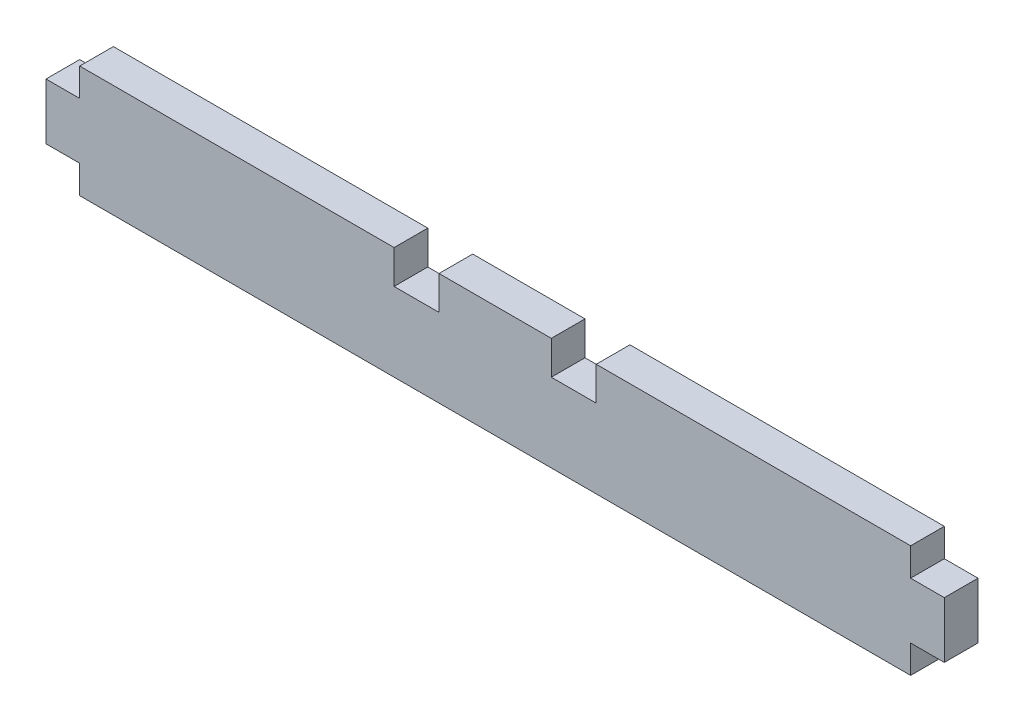
ISO-10303-21;
HEADER;
FILE_DESCRIPTION(('STEP AP214'),'2;1');
FILE_NAME('part.step','',(''),(''),'','','');
FILE_SCHEMA(('AUTOMOTIVE_DESIGN { 1 0 10303 214 1 1 1 1 }'));
ENDSEC;
DATA;
#1=APPLICATION_CONTEXT('core data for automotive mechanical design processes');
#2=APPLICATION_PROTOCOL_DEFINITION('international standard','automotive_design',2000,#1);
#3=PRODUCT_CONTEXT('',#1,'mechanical');
#4=PRODUCT('Part','Part','',(#3));
#5=PRODUCT_RELATED_PRODUCT_CATEGORY('part','',(#4));
#6=PRODUCT_DEFINITION_FORMATION('','',#4);
#7=PRODUCT_DEFINITION_CONTEXT('part definition',#1,'design');
#8=PRODUCT_DEFINITION('design','',#6,#7);
#9=PRODUCT_DEFINITION_SHAPE('','',#8);
#10=(LENGTH_UNIT() NAMED_UNIT(*) SI_UNIT(.MILLI.,.METRE.));
#11=(NAMED_UNIT(*) PLANE_ANGLE_UNIT() SI_UNIT($,.RADIAN.));
#12=(NAMED_UNIT(*) SI_UNIT($,.STERADIAN.) SOLID_ANGLE_UNIT());
#13=UNCERTAINTY_MEASURE_WITH_UNIT(LENGTH_MEASURE(1.E-05),#10,'distance_accuracy_value','');
#14=(GEOMETRIC_REPRESENTATION_CONTEXT(3) GLOBAL_UNCERTAINTY_ASSIGNED_CONTEXT((#13)) GLOBAL_UNIT_ASSIGNED_CONTEXT((#10,
#11,#12)) REPRESENTATION_CONTEXT('',''));
#15=CARTESIAN_POINT('',(0.,0.,0.));
#16=DIRECTION('',(0.,0.,1.));
#17=DIRECTION('',(1.,0.,0.));
#18=AXIS2_PLACEMENT_3D('',#15,#16,#17);
#19=CARTESIAN_POINT('',(-9.,0.,3.));
#20=DIRECTION('',(-1.,0.,0.));
#21=DIRECTION('',(0.,0.,1.));
#22=AXIS2_PLACEMENT_3D('',#19,#20,#21);
#23=PLANE('',#22);
#24=DIRECTION('',(0.,1.,0.));
#25=VECTOR('',#24,1.);
#26=CARTESIAN_POINT('',(-9.,0.,0.));
#27=LINE('',#26,#25);
#28=CARTESIAN_POINT('',(-9.,3.5,0.));
#29=VERTEX_POINT('',#28);
#30=CARTESIAN_POINT('',(-9.,6.5,0.));
#31=VERTEX_POINT('',#30);
#32=EDGE_CURVE('E238',#29,#31,#27,.T.);
#33=ORIENTED_EDGE('',*,*,#32,.T.);
#34=DIRECTION('',(0.,0.,-1.));
#35=VECTOR('',#34,1.);
#36=CARTESIAN_POINT('',(-9.,6.5,3.));
#37=LINE('',#36,#35);
#38=CARTESIAN_POINT('',(-9.,6.5,3.));
#39=VERTEX_POINT('',#38);
#40=EDGE_CURVE('E227',#39,#31,#37,.T.);
#41=ORIENTED_EDGE('',*,*,#40,.F.);
#42=DIRECTION('',(0.,1.,0.));
#43=VECTOR('',#42,1.);
#44=CARTESIAN_POINT('',(-9.,0.,3.));
#45=LINE('',#44,#43);
#46=CARTESIAN_POINT('',(-9.,3.5,3.));
#47=VERTEX_POINT('',#46);
#48=EDGE_CURVE('E270',#47,#39,#45,.T.);
#49=ORIENTED_EDGE('',*,*,#48,.F.);
#50=DIRECTION('',(0.,0.,-1.));
#51=VECTOR('',#50,1.);
#52=CARTESIAN_POINT('',(-9.,3.5,3.));
#53=LINE('',#52,#51);
#54=EDGE_CURVE('E224',#47,#29,#53,.T.);
#55=ORIENTED_EDGE('',*,*,#54,.T.);
#56=EDGE_LOOP('',(#33,#41,#49,#55));
#57=FACE_BOUND('',#56,.T.);
#58=ADVANCED_FACE('F83',(#57),#23,.F.);
#59=CARTESIAN_POINT('',(0.,3.5,3.));
#60=DIRECTION('',(0.,1.,0.));
#61=DIRECTION('',(0.,0.,1.));
#62=AXIS2_PLACEMENT_3D('',#59,#60,#61);
#63=PLANE('',#62);
#64=DIRECTION('',(1.,0.,0.));
#65=VECTOR('',#64,1.);
#66=CARTESIAN_POINT('',(0.,3.5,0.));
#67=LINE('',#66,#65);
#68=CARTESIAN_POINT('',(-5.,3.5,0.));
#69=VERTEX_POINT('',#68);
#70=EDGE_CURVE('E241',#29,#69,#67,.T.);
#71=ORIENTED_EDGE('',*,*,#70,.F.);
#72=ORIENTED_EDGE('',*,*,#54,.F.);
#73=DIRECTION('',(1.,0.,0.));
#74=VECTOR('',#73,1.);
#75=CARTESIAN_POINT('',(0.,3.5,3.));
#76=LINE('',#75,#74);
#77=CARTESIAN_POINT('',(-5.,3.5,3.));
#78=VERTEX_POINT('',#77);
#79=EDGE_CURVE('E273',#47,#78,#76,.T.);
#80=ORIENTED_EDGE('',*,*,#79,.T.);
#81=DIRECTION('',(0.,0.,-1.));
#82=VECTOR('',#81,1.);
#83=CARTESIAN_POINT('',(-5.,3.5,3.));
#84=LINE('',#83,#82);
#85=EDGE_CURVE('E221',#78,#69,#84,.T.);
#86=ORIENTED_EDGE('',*,*,#85,.T.);
#87=EDGE_LOOP('',(#71,#72,#80,#86));
#88=FACE_BOUND('',#87,.T.);
#89=ADVANCED_FACE('F384',(#88),#63,.T.);
#90=CARTESIAN_POINT('',(-5.,0.,3.));
#91=DIRECTION('',(-1.,0.,0.));
#92=DIRECTION('',(0.,0.,1.));
#93=AXIS2_PLACEMENT_3D('',#90,#91,#92);
#94=PLANE('',#93);
#95=DIRECTION('',(0.,1.,0.));
#96=VECTOR('',#95,1.);
#97=CARTESIAN_POINT('',(-5.,0.,0.));
#98=LINE('',#97,#96);
#99=CARTESIAN_POINT('',(-5.,6.5,0.));
#100=VERTEX_POINT('',#99);
#101=EDGE_CURVE('E242',#69,#100,#98,.T.);
#102=ORIENTED_EDGE('',*,*,#101,.F.);
#103=ORIENTED_EDGE('',*,*,#85,.F.);
#104=DIRECTION('',(0.,1.,0.));
#105=VECTOR('',#104,1.);
#106=CARTESIAN_POINT('',(-5.,0.,3.));
#107=LINE('',#106,#105);
#108=CARTESIAN_POINT('',(-5.,6.5,3.));
#109=VERTEX_POINT('',#108);
#110=EDGE_CURVE('E274',#78,#109,#107,.T.);
#111=ORIENTED_EDGE('',*,*,#110,.T.);
#112=DIRECTION('',(0.,0.,-1.));
#113=VECTOR('',#112,1.);
#114=CARTESIAN_POINT('',(-5.,6.5,3.));
#115=LINE('',#114,#113);
#116=EDGE_CURVE('E218',#109,#100,#115,.T.);
#117=ORIENTED_EDGE('',*,*,#116,.T.);
#118=EDGE_LOOP('',(#102,#103,#111,#117));
#119=FACE_BOUND('',#118,.T.);
#120=ADVANCED_FACE('F389',(#119),#94,.T.);
#121=CARTESIAN_POINT('',(0.,6.5,3.));
#122=DIRECTION('',(0.,1.,0.));
#123=DIRECTION('',(0.,0.,1.));
#124=AXIS2_PLACEMENT_3D('',#121,#122,#123);
#125=PLANE('',#124);
#126=DIRECTION('',(1.,0.,0.));
#127=VECTOR('',#126,1.);
#128=CARTESIAN_POINT('',(0.,6.5,0.));
#129=LINE('',#128,#127);
#130=CARTESIAN_POINT('',(5.,6.5,0.));
#131=VERTEX_POINT('',#130);
#132=EDGE_CURVE('E245',#100,#131,#129,.T.);
#133=ORIENTED_EDGE('',*,*,#132,.F.);
#134=ORIENTED_EDGE('',*,*,#116,.F.);
#135=DIRECTION('',(1.,0.,0.));
#136=VECTOR('',#135,1.);
#137=CARTESIAN_POINT('',(0.,6.5,3.));
#138=LINE('',#137,#136);
#139=CARTESIAN_POINT('',(5.,6.5,3.));
#140=VERTEX_POINT('',#139);
#141=EDGE_CURVE('E277',#109,#140,#138,.T.);
#142=ORIENTED_EDGE('',*,*,#141,.T.);
#143=DIRECTION('',(0.,0.,-1.));
#144=VECTOR('',#143,1.);
#145=CARTESIAN_POINT('',(5.,6.5,3.));
#146=LINE('',#145,#144);
#147=EDGE_CURVE('E215',#140,#131,#146,.T.);
#148=ORIENTED_EDGE('',*,*,#147,.T.);
#149=EDGE_LOOP('',(#133,#134,#142,#148));
#150=FACE_BOUND('',#149,.T.);
#151=ADVANCED_FACE('F395',(#150),#125,.T.);
#152=CARTESIAN_POINT('',(5.,0.,3.));
#153=DIRECTION('',(-1.,0.,0.));
#154=DIRECTION('',(0.,0.,1.));
#155=AXIS2_PLACEMENT_3D('',#152,#153,#154);
#156=PLANE('',#155);
#157=DIRECTION('',(0.,1.,0.));
#158=VECTOR('',#157,1.);
#159=CARTESIAN_POINT('',(5.,0.,0.));
#160=LINE('',#159,#158);
#161=CARTESIAN_POINT('',(5.,3.5,0.));
#162=VERTEX_POINT('',#161);
#163=EDGE_CURVE('E248',#162,#131,#160,.T.);
#164=ORIENTED_EDGE('',*,*,#163,.T.);
#165=ORIENTED_EDGE('',*,*,#147,.F.);
#166=DIRECTION('',(0.,1.,0.));
#167=VECTOR('',#166,1.);
#168=CARTESIAN_POINT('',(5.,0.,3.));
#169=LINE('',#168,#167);
#170=CARTESIAN_POINT('',(5.,3.5,3.));
#171=VERTEX_POINT('',#170);
#172=EDGE_CURVE('E280',#171,#140,#169,.T.);
#173=ORIENTED_EDGE('',*,*,#172,.F.);
#174=DIRECTION('',(0.,0.,-1.));
#175=VECTOR('',#174,1.);
#176=CARTESIAN_POINT('',(5.,3.5,3.));
#177=LINE('',#176,#175);
#178=EDGE_CURVE('E212',#171,#162,#177,.T.);
#179=ORIENTED_EDGE('',*,*,#178,.T.);
#180=EDGE_LOOP('',(#164,#165,#173,#179));
#181=FACE_BOUND('',#180,.T.);
#182=ADVANCED_FACE('F402',(#181),#156,.F.);
#183=CARTESIAN_POINT('',(9.,3.5,0.));
#184=VERTEX_POINT('',#183);
#185=EDGE_CURVE('E251',#162,#184,#67,.T.);
#186=ORIENTED_EDGE('',*,*,#185,.F.);
#187=ORIENTED_EDGE('',*,*,#178,.F.);
#188=CARTESIAN_POINT('',(9.,3.5,3.));
#189=VERTEX_POINT('',#188);
#190=EDGE_CURVE('E283',#171,#189,#76,.T.);
#191=ORIENTED_EDGE('',*,*,#190,.T.);
#192=DIRECTION('',(0.,0.,-1.));
#193=VECTOR('',#192,1.);
#194=CARTESIAN_POINT('',(9.,3.5,3.));
#195=LINE('',#194,#193);
#196=EDGE_CURVE('E209',#189,#184,#195,.T.);
#197=ORIENTED_EDGE('',*,*,#196,.T.);
#198=EDGE_LOOP('',(#186,#187,#191,#197));
#199=FACE_BOUND('',#198,.T.);
#200=ADVANCED_FACE('F407',(#199),#63,.T.);
#201=CARTESIAN_POINT('',(9.,0.,3.));
#202=DIRECTION('',(-1.,0.,0.));
#203=DIRECTION('',(0.,0.,1.));
#204=AXIS2_PLACEMENT_3D('',#201,#202,#203);
#205=PLANE('',#204);
#206=DIRECTION('',(0.,1.,0.));
#207=VECTOR('',#206,1.);
#208=CARTESIAN_POINT('',(9.,0.,0.));
#209=LINE('',#208,#207);
#210=CARTESIAN_POINT('',(9.,6.5,0.));
#211=VERTEX_POINT('',#210);
#212=EDGE_CURVE('E254',#184,#211,#209,.T.);
#213=ORIENTED_EDGE('',*,*,#212,.F.);
#214=ORIENTED_EDGE('',*,*,#196,.F.);
#215=DIRECTION('',(0.,1.,0.));
#216=VECTOR('',#215,1.);
#217=CARTESIAN_POINT('',(9.,0.,3.));
#218=LINE('',#217,#216);
#219=CARTESIAN_POINT('',(9.,6.5,3.));
#220=VERTEX_POINT('',#219);
#221=EDGE_CURVE('E286',#189,#220,#218,.T.);
#222=ORIENTED_EDGE('',*,*,#221,.T.);
#223=DIRECTION('',(0.,0.,-1.));
#224=VECTOR('',#223,1.);
#225=CARTESIAN_POINT('',(9.,6.5,3.));
#226=LINE('',#225,#224);
#227=EDGE_CURVE('E206',#220,#211,#226,.T.);
#228=ORIENTED_EDGE('',*,*,#227,.T.);
#229=EDGE_LOOP('',(#213,#214,#222,#228));
#230=FACE_BOUND('',#229,.T.);
#231=ADVANCED_FACE('F452',(#230),#205,.T.);
#232=CARTESIAN_POINT('',(0.,6.5,3.));
#233=DIRECTION('',(0.,1.,0.));
#234=DIRECTION('',(0.,0.,1.));
#235=AXIS2_PLACEMENT_3D('',#232,#233,#234);
#236=PLANE('',#235);
#237=DIRECTION('',(1.,0.,0.));
#238=VECTOR('',#237,1.);
#239=CARTESIAN_POINT('',(0.,6.5,0.));
#240=LINE('',#239,#238);
#241=CARTESIAN_POINT('',(-37.,6.5,0.));
#242=VERTEX_POINT('',#241);
#243=EDGE_CURVE('E234',#242,#31,#240,.T.);
#244=ORIENTED_EDGE('',*,*,#243,.F.);
#245=DIRECTION('',(0.,0.,-1.));
#246=VECTOR('',#245,1.);
#247=CARTESIAN_POINT('',(-37.,6.5,3.));
#248=LINE('',#247,#246);
#249=CARTESIAN_POINT('',(-37.,6.5,3.));
#250=VERTEX_POINT('',#249);
#251=EDGE_CURVE('E230',#250,#242,#248,.T.);
#252=ORIENTED_EDGE('',*,*,#251,.F.);
#253=DIRECTION('',(1.,0.,0.));
#254=VECTOR('',#253,1.);
#255=CARTESIAN_POINT('',(0.,6.5,3.));
#256=LINE('',#255,#254);
#257=EDGE_CURVE('E233',#250,#39,#256,.T.);
#258=ORIENTED_EDGE('',*,*,#257,.T.);
#259=ORIENTED_EDGE('',*,*,#40,.T.);
#260=EDGE_LOOP('',(#244,#252,#258,#259));
#261=FACE_BOUND('',#260,.T.);
#262=ADVANCED_FACE('F315',(#261),#236,.T.);
#263=CARTESIAN_POINT('',(0.,-3.5,3.));
#264=DIRECTION('',(0.,1.,0.));
#265=DIRECTION('',(0.,0.,1.));
#266=AXIS2_PLACEMENT_3D('',#263,#264,#265);
#267=PLANE('',#266);
#268=DIRECTION('',(1.,0.,0.));
#269=VECTOR('',#268,1.);
#270=CARTESIAN_POINT('',(0.,-3.5,0.));
#271=LINE('',#270,#269);
#272=CARTESIAN_POINT('',(-37.,-3.5,0.));
#273=VERTEX_POINT('',#272);
#274=CARTESIAN_POINT('',(37.,-3.5,0.));
#275=VERTEX_POINT('',#274);
#276=EDGE_CURVE('E263',#273,#275,#271,.T.);
#277=ORIENTED_EDGE('',*,*,#276,.T.);
#278=DIRECTION('',(0.,0.,-1.));
#279=VECTOR('',#278,1.);
#280=CARTESIAN_POINT('',(37.,-3.5,3.));
#281=LINE('',#280,#279);
#282=CARTESIAN_POINT('',(37.,-3.5,3.));
#283=VERTEX_POINT('',#282);
#284=EDGE_CURVE('E200',#283,#275,#281,.T.);
#285=ORIENTED_EDGE('',*,*,#284,.F.);
#286=DIRECTION('',(1.,0.,0.));
#287=VECTOR('',#286,1.);
#288=CARTESIAN_POINT('',(0.,-3.5,3.));
#289=LINE('',#288,#287);
#290=CARTESIAN_POINT('',(-37.,-3.5,3.));
#291=VERTEX_POINT('',#290);
#292=EDGE_CURVE('E296',#291,#283,#289,.T.);
#293=ORIENTED_EDGE('',*,*,#292,.F.);
#294=DIRECTION('',(0.,0.,-1.));
#295=VECTOR('',#294,1.);
#296=CARTESIAN_POINT('',(-37.,-3.5,3.));
#297=LINE('',#296,#295);
#298=EDGE_CURVE('E197',#291,#273,#297,.T.);
#299=ORIENTED_EDGE('',*,*,#298,.T.);
#300=EDGE_LOOP('',(#277,#285,#293,#299));
#301=FACE_BOUND('',#300,.T.);
#302=ADVANCED_FACE('F365',(#301),#267,.F.);
#303=CARTESIAN_POINT('',(0.,6.49999999999999,3.));
#304=DIRECTION('',(0.,-1.,0.));
#305=DIRECTION('',(1.,0.,0.));
#306=AXIS2_PLACEMENT_3D('',#303,#304,#305);
#307=PLANE('',#306);
#308=DIRECTION('',(-1.,0.,0.));
#309=VECTOR('',#308,1.);
#310=CARTESIAN_POINT('',(0.,6.49999999999999,0.));
#311=LINE('',#310,#309);
#312=CARTESIAN_POINT('',(37.,6.5,0.));
#313=VERTEX_POINT('',#312);
#314=EDGE_CURVE('E257',#313,#211,#311,.T.);
#315=ORIENTED_EDGE('',*,*,#314,.T.);
#316=ORIENTED_EDGE('',*,*,#227,.F.);
#317=DIRECTION('',(-1.,0.,0.));
#318=VECTOR('',#317,1.);
#319=CARTESIAN_POINT('',(0.,6.49999999999999,3.));
#320=LINE('',#319,#318);
#321=CARTESIAN_POINT('',(37.,6.5,3.));
#322=VERTEX_POINT('',#321);
#323=EDGE_CURVE('E289',#322,#220,#320,.T.);
#324=ORIENTED_EDGE('',*,*,#323,.F.);
#325=DIRECTION('',(0.,0.,-1.));
#326=VECTOR('',#325,1.);
#327=CARTESIAN_POINT('',(37.,6.5,3.));
#328=LINE('',#327,#326);
#329=EDGE_CURVE('E203',#322,#313,#328,.T.);
#330=ORIENTED_EDGE('',*,*,#329,.T.);
#331=EDGE_LOOP('',(#315,#316,#324,#330));
#332=FACE_BOUND('',#331,.T.);
#333=ADVANCED_FACE('F455',(#332),#307,.F.);
#334=CARTESIAN_POINT('',(0.,0.,0.));
#335=DIRECTION('',(0.,0.,1.));
#336=DIRECTION('',(1.,0.,0.));
#337=AXIS2_PLACEMENT_3D('',#334,#335,#336);
#338=PLANE('',#337);
#339=DIRECTION('',(0.,1.,0.));
#340=VECTOR('',#339,1.);
#341=CARTESIAN_POINT('',(-37.,0.,0.));
#342=LINE('',#341,#340);
#343=CARTESIAN_POINT('',(-37.,-0.999999999999999,0.));
#344=VERTEX_POINT('',#343);
#345=EDGE_CURVE('E266',#273,#344,#342,.T.);
#346=ORIENTED_EDGE('',*,*,#345,.T.);
#347=DIRECTION('',(-1.,0.,0.));
#348=VECTOR('',#347,1.);
#349=CARTESIAN_POINT('',(-37.,-0.999999999999999,0.));
#350=LINE('',#349,#348);
#351=CARTESIAN_POINT('',(-40.,-0.999999999999999,0.));
#352=VERTEX_POINT('',#351);
#353=EDGE_CURVE('E182',#344,#352,#350,.T.);
#354=ORIENTED_EDGE('',*,*,#353,.T.);
#355=DIRECTION('',(0.,1.,0.));
#356=VECTOR('',#355,1.);
#357=CARTESIAN_POINT('',(-40.,-0.999999999999999,0.));
#358=LINE('',#357,#356);
#359=CARTESIAN_POINT('',(-40.,4.,0.));
#360=VERTEX_POINT('',#359);
#361=EDGE_CURVE('E186',#352,#360,#358,.T.);
#362=ORIENTED_EDGE('',*,*,#361,.T.);
#363=DIRECTION('',(-1.,0.,0.));
#364=VECTOR('',#363,1.);
#365=CARTESIAN_POINT('',(-37.,4.,0.));
#366=LINE('',#365,#364);
#367=CARTESIAN_POINT('',(-37.,4.,0.));
#368=VERTEX_POINT('',#367);
#369=EDGE_CURVE('E158',#368,#360,#366,.T.);
#370=ORIENTED_EDGE('',*,*,#369,.F.);
#371=EDGE_CURVE('E176',#368,#242,#342,.T.);
#372=ORIENTED_EDGE('',*,*,#371,.T.);
#373=ORIENTED_EDGE('',*,*,#243,.T.);
#374=ORIENTED_EDGE('',*,*,#32,.F.);
#375=ORIENTED_EDGE('',*,*,#70,.T.);
#376=ORIENTED_EDGE('',*,*,#101,.T.);
#377=ORIENTED_EDGE('',*,*,#132,.T.);
#378=ORIENTED_EDGE('',*,*,#163,.F.);
#379=ORIENTED_EDGE('',*,*,#185,.T.);
#380=ORIENTED_EDGE('',*,*,#212,.T.);
#381=ORIENTED_EDGE('',*,*,#314,.F.);
#382=DIRECTION('',(0.,-1.,0.));
#383=VECTOR('',#382,1.);
#384=CARTESIAN_POINT('',(37.,0.,0.));
#385=LINE('',#384,#383);
#386=CARTESIAN_POINT('',(37.,4.,0.));
#387=VERTEX_POINT('',#386);
#388=EDGE_CURVE('E260',#313,#387,#385,.T.);
#389=ORIENTED_EDGE('',*,*,#388,.T.);
#390=DIRECTION('',(1.,0.,0.));
#391=VECTOR('',#390,1.);
#392=CARTESIAN_POINT('',(37.,4.,0.));
#393=LINE('',#392,#391);
#394=CARTESIAN_POINT('',(40.,4.,0.));
#395=VERTEX_POINT('',#394);
#396=EDGE_CURVE('E163',#387,#395,#393,.T.);
#397=ORIENTED_EDGE('',*,*,#396,.T.);
#398=DIRECTION('',(0.,1.,0.));
#399=VECTOR('',#398,1.);
#400=CARTESIAN_POINT('',(40.,-0.999999999999998,0.));
#401=LINE('',#400,#399);
#402=CARTESIAN_POINT('',(40.,-0.999999999999998,0.));
#403=VERTEX_POINT('',#402);
#404=EDGE_CURVE('E152',#403,#395,#401,.T.);
#405=ORIENTED_EDGE('',*,*,#404,.F.);
#406=DIRECTION('',(1.,0.,0.));
#407=VECTOR('',#406,1.);
#408=CARTESIAN_POINT('',(37.,-0.999999999999998,0.));
#409=LINE('',#408,#407);
#410=CARTESIAN_POINT('',(37.,-0.999999999999998,0.));
#411=VERTEX_POINT('',#410);
#412=EDGE_CURVE('E138',#411,#403,#409,.T.);
#413=ORIENTED_EDGE('',*,*,#412,.F.);
#414=EDGE_CURVE('E262',#411,#275,#385,.T.);
#415=ORIENTED_EDGE('',*,*,#414,.T.);
#416=ORIENTED_EDGE('',*,*,#276,.F.);
#417=EDGE_LOOP('',(#346,#354,#362,#370,#372,#373,#374,#375,#376,#377,#378,#379,#380,#381,#389,
#397,#405,#413,#415,#416));
#418=FACE_BOUND('',#417,.T.);
#419=ADVANCED_FACE('F161',(#418),#338,.F.);
#420=CARTESIAN_POINT('',(0.,0.,3.));
#421=DIRECTION('',(0.,0.,1.));
#422=DIRECTION('',(1.,0.,0.));
#423=AXIS2_PLACEMENT_3D('',#420,#421,#422);
#424=PLANE('',#423);
#425=DIRECTION('',(0.,1.,0.));
#426=VECTOR('',#425,1.);
#427=CARTESIAN_POINT('',(-37.,0.,3.));
#428=LINE('',#427,#426);
#429=CARTESIAN_POINT('',(-37.,-0.999999999999999,3.));
#430=VERTEX_POINT('',#429);
#431=EDGE_CURVE('E299',#291,#430,#428,.T.);
#432=ORIENTED_EDGE('',*,*,#431,.F.);
#433=ORIENTED_EDGE('',*,*,#292,.T.);
#434=DIRECTION('',(0.,-1.,0.));
#435=VECTOR('',#434,1.);
#436=CARTESIAN_POINT('',(37.,0.,3.));
#437=LINE('',#436,#435);
#438=CARTESIAN_POINT('',(37.,-0.999999999999998,3.));
#439=VERTEX_POINT('',#438);
#440=EDGE_CURVE('E295',#439,#283,#437,.T.);
#441=ORIENTED_EDGE('',*,*,#440,.F.);
#442=DIRECTION('',(1.,0.,0.));
#443=VECTOR('',#442,1.);
#444=CARTESIAN_POINT('',(37.,-0.999999999999998,3.));
#445=LINE('',#444,#443);
#446=CARTESIAN_POINT('',(40.,-0.999999999999998,3.));
#447=VERTEX_POINT('',#446);
#448=EDGE_CURVE('E168',#439,#447,#445,.T.);
#449=ORIENTED_EDGE('',*,*,#448,.T.);
#450=DIRECTION('',(0.,1.,0.));
#451=VECTOR('',#450,1.);
#452=CARTESIAN_POINT('',(40.,-0.999999999999998,3.));
#453=LINE('',#452,#451);
#454=CARTESIAN_POINT('',(40.,4.,3.));
#455=VERTEX_POINT('',#454);
#456=EDGE_CURVE('E157',#447,#455,#453,.T.);
#457=ORIENTED_EDGE('',*,*,#456,.T.);
#458=DIRECTION('',(1.,0.,0.));
#459=VECTOR('',#458,1.);
#460=CARTESIAN_POINT('',(37.,4.,3.));
#461=LINE('',#460,#459);
#462=CARTESIAN_POINT('',(37.,4.,3.));
#463=VERTEX_POINT('',#462);
#464=EDGE_CURVE('E151',#463,#455,#461,.T.);
#465=ORIENTED_EDGE('',*,*,#464,.F.);
#466=EDGE_CURVE('E292',#322,#463,#437,.T.);
#467=ORIENTED_EDGE('',*,*,#466,.F.);
#468=ORIENTED_EDGE('',*,*,#323,.T.);
#469=ORIENTED_EDGE('',*,*,#221,.F.);
#470=ORIENTED_EDGE('',*,*,#190,.F.);
#471=ORIENTED_EDGE('',*,*,#172,.T.);
#472=ORIENTED_EDGE('',*,*,#141,.F.);
#473=ORIENTED_EDGE('',*,*,#110,.F.);
#474=ORIENTED_EDGE('',*,*,#79,.F.);
#475=ORIENTED_EDGE('',*,*,#48,.T.);
#476=ORIENTED_EDGE('',*,*,#257,.F.);
#477=CARTESIAN_POINT('',(-37.,4.,3.));
#478=VERTEX_POINT('',#477);
#479=EDGE_CURVE('E237',#478,#250,#428,.T.);
#480=ORIENTED_EDGE('',*,*,#479,.F.);
#481=DIRECTION('',(-1.,0.,0.));
#482=VECTOR('',#481,1.);
#483=CARTESIAN_POINT('',(-37.,4.,3.));
#484=LINE('',#483,#482);
#485=CARTESIAN_POINT('',(-40.,4.,3.));
#486=VERTEX_POINT('',#485);
#487=EDGE_CURVE('E185',#478,#486,#484,.T.);
#488=ORIENTED_EDGE('',*,*,#487,.T.);
#489=DIRECTION('',(0.,1.,0.));
#490=VECTOR('',#489,1.);
#491=CARTESIAN_POINT('',(-40.,-0.999999999999999,3.));
#492=LINE('',#491,#490);
#493=CARTESIAN_POINT('',(-40.,-0.999999999999999,3.));
#494=VERTEX_POINT('',#493);
#495=EDGE_CURVE('E193',#494,#486,#492,.T.);
#496=ORIENTED_EDGE('',*,*,#495,.F.);
#497=DIRECTION('',(-1.,0.,0.));
#498=VECTOR('',#497,1.);
#499=CARTESIAN_POINT('',(-37.,-0.999999999999999,3.));
#500=LINE('',#499,#498);
#501=EDGE_CURVE('E179',#430,#494,#500,.T.);
#502=ORIENTED_EDGE('',*,*,#501,.F.);
#503=EDGE_LOOP('',(#432,#433,#441,#449,#457,#465,#467,#468,#469,#470,#471,#472,#473,#474,#475,
#476,#480,#488,#496,#502));
#504=FACE_BOUND('',#503,.T.);
#505=ADVANCED_FACE('F316',(#504),#424,.T.);
#506=CARTESIAN_POINT('',(37.,0.,3.));
#507=DIRECTION('',(1.,0.,0.));
#508=DIRECTION('',(0.,0.,-1.));
#509=AXIS2_PLACEMENT_3D('',#506,#507,#508);
#510=PLANE('',#509);
#511=ORIENTED_EDGE('',*,*,#466,.T.);
#512=DIRECTION('',(0.,0.,-1.));
#513=VECTOR('',#512,1.);
#514=CARTESIAN_POINT('',(37.,4.,3.));
#515=LINE('',#514,#513);
#516=EDGE_CURVE('E87',#463,#387,#515,.T.);
#517=ORIENTED_EDGE('',*,*,#516,.T.);
#518=ORIENTED_EDGE('',*,*,#388,.F.);
#519=ORIENTED_EDGE('',*,*,#329,.F.);
#520=EDGE_LOOP('',(#511,#517,#518,#519));
#521=FACE_BOUND('',#520,.T.);
#522=ADVANCED_FACE('F427',(#521),#510,.T.);
#523=DIRECTION('',(0.,0.,-1.));
#524=VECTOR('',#523,1.);
#525=CARTESIAN_POINT('',(37.,-0.999999999999998,3.));
#526=LINE('',#525,#524);
#527=EDGE_CURVE('E146',#439,#411,#526,.T.);
#528=ORIENTED_EDGE('',*,*,#527,.F.);
#529=ORIENTED_EDGE('',*,*,#440,.T.);
#530=ORIENTED_EDGE('',*,*,#284,.T.);
#531=ORIENTED_EDGE('',*,*,#414,.F.);
#532=EDGE_LOOP('',(#528,#529,#530,#531));
#533=FACE_BOUND('',#532,.T.);
#534=ADVANCED_FACE('F425',(#533),#510,.T.);
#535=CARTESIAN_POINT('',(-37.,0.,3.));
#536=DIRECTION('',(-1.,0.,0.));
#537=DIRECTION('',(0.,0.,1.));
#538=AXIS2_PLACEMENT_3D('',#535,#536,#537);
#539=PLANE('',#538);
#540=ORIENTED_EDGE('',*,*,#431,.T.);
#541=DIRECTION('',(0.,0.,-1.));
#542=VECTOR('',#541,1.);
#543=CARTESIAN_POINT('',(-37.,-0.999999999999999,3.));
#544=LINE('',#543,#542);
#545=EDGE_CURVE('E93',#430,#344,#544,.T.);
#546=ORIENTED_EDGE('',*,*,#545,.T.);
#547=ORIENTED_EDGE('',*,*,#345,.F.);
#548=ORIENTED_EDGE('',*,*,#298,.F.);
#549=EDGE_LOOP('',(#540,#546,#547,#548));
#550=FACE_BOUND('',#549,.T.);
#551=ADVANCED_FACE('F358',(#550),#539,.T.);
#552=DIRECTION('',(0.,0.,-1.));
#553=VECTOR('',#552,1.);
#554=CARTESIAN_POINT('',(-37.,4.,3.));
#555=LINE('',#554,#553);
#556=EDGE_CURVE('E12',#478,#368,#555,.T.);
#557=ORIENTED_EDGE('',*,*,#556,.F.);
#558=ORIENTED_EDGE('',*,*,#479,.T.);
#559=ORIENTED_EDGE('',*,*,#251,.T.);
#560=ORIENTED_EDGE('',*,*,#371,.F.);
#561=EDGE_LOOP('',(#557,#558,#559,#560));
#562=FACE_BOUND('',#561,.T.);
#563=ADVANCED_FACE('F307',(#562),#539,.T.);
#564=CARTESIAN_POINT('',(40.,-0.999999999999998,3.));
#565=DIRECTION('',(-1.,0.,0.));
#566=DIRECTION('',(0.,0.,1.));
#567=AXIS2_PLACEMENT_3D('',#564,#565,#566);
#568=PLANE('',#567);
#569=ORIENTED_EDGE('',*,*,#404,.T.);
#570=DIRECTION('',(0.,0.,-1.));
#571=VECTOR('',#570,1.);
#572=CARTESIAN_POINT('',(40.,4.,3.));
#573=LINE('',#572,#571);
#574=EDGE_CURVE('E131',#455,#395,#573,.T.);
#575=ORIENTED_EDGE('',*,*,#574,.F.);
#576=ORIENTED_EDGE('',*,*,#456,.F.);
#577=DIRECTION('',(0.,0.,-1.));
#578=VECTOR('',#577,1.);
#579=CARTESIAN_POINT('',(40.,-0.999999999999998,3.));
#580=LINE('',#579,#578);
#581=EDGE_CURVE('E142',#447,#403,#580,.T.);
#582=ORIENTED_EDGE('',*,*,#581,.T.);
#583=EDGE_LOOP('',(#569,#575,#576,#582));
#584=FACE_BOUND('',#583,.T.);
#585=ADVANCED_FACE('F155',(#584),#568,.F.);
#586=CARTESIAN_POINT('',(37.,4.,3.));
#587=DIRECTION('',(0.,1.,0.));
#588=DIRECTION('',(-1.,0.,0.));
#589=AXIS2_PLACEMENT_3D('',#586,#587,#588);
#590=PLANE('',#589);
#591=ORIENTED_EDGE('',*,*,#396,.F.);
#592=ORIENTED_EDGE('',*,*,#516,.F.);
#593=ORIENTED_EDGE('',*,*,#464,.T.);
#594=ORIENTED_EDGE('',*,*,#574,.T.);
#595=EDGE_LOOP('',(#591,#592,#593,#594));
#596=FACE_BOUND('',#595,.T.);
#597=ADVANCED_FACE('F85',(#596),#590,.T.);
#598=CARTESIAN_POINT('',(37.,-0.999999999999998,3.));
#599=DIRECTION('',(0.,1.,0.));
#600=DIRECTION('',(-1.,0.,0.));
#601=AXIS2_PLACEMENT_3D('',#598,#599,#600);
#602=PLANE('',#601);
#603=ORIENTED_EDGE('',*,*,#412,.T.);
#604=ORIENTED_EDGE('',*,*,#581,.F.);
#605=ORIENTED_EDGE('',*,*,#448,.F.);
#606=ORIENTED_EDGE('',*,*,#527,.T.);
#607=EDGE_LOOP('',(#603,#604,#605,#606));
#608=FACE_BOUND('',#607,.T.);
#609=ADVANCED_FACE('F140',(#608),#602,.F.);
#610=CARTESIAN_POINT('',(-40.,-0.999999999999999,3.));
#611=DIRECTION('',(-1.,0.,0.));
#612=DIRECTION('',(0.,0.,1.));
#613=AXIS2_PLACEMENT_3D('',#610,#611,#612);
#614=PLANE('',#613);
#615=ORIENTED_EDGE('',*,*,#361,.F.);
#616=DIRECTION('',(0.,0.,-1.));
#617=VECTOR('',#616,1.);
#618=CARTESIAN_POINT('',(-40.,-0.999999999999999,3.));
#619=LINE('',#618,#617);
#620=EDGE_CURVE('E177',#494,#352,#619,.T.);
#621=ORIENTED_EDGE('',*,*,#620,.F.);
#622=ORIENTED_EDGE('',*,*,#495,.T.);
#623=DIRECTION('',(0.,0.,-1.));
#624=VECTOR('',#623,1.);
#625=CARTESIAN_POINT('',(-40.,4.,3.));
#626=LINE('',#625,#624);
#627=EDGE_CURVE('E174',#486,#360,#626,.T.);
#628=ORIENTED_EDGE('',*,*,#627,.T.);
#629=EDGE_LOOP('',(#615,#621,#622,#628));
#630=FACE_BOUND('',#629,.T.);
#631=ADVANCED_FACE('F352',(#630),#614,.T.);
#632=CARTESIAN_POINT('',(-37.,-0.999999999999999,3.));
#633=DIRECTION('',(0.,-1.,0.));
#634=DIRECTION('',(1.,0.,0.));
#635=AXIS2_PLACEMENT_3D('',#632,#633,#634);
#636=PLANE('',#635);
#637=ORIENTED_EDGE('',*,*,#353,.F.);
#638=ORIENTED_EDGE('',*,*,#545,.F.);
#639=ORIENTED_EDGE('',*,*,#501,.T.);
#640=ORIENTED_EDGE('',*,*,#620,.T.);
#641=EDGE_LOOP('',(#637,#638,#639,#640));
#642=FACE_BOUND('',#641,.T.);
#643=ADVANCED_FACE('F356',(#642),#636,.T.);
#644=CARTESIAN_POINT('',(-37.,4.,3.));
#645=DIRECTION('',(0.,-1.,0.));
#646=DIRECTION('',(1.,0.,0.));
#647=AXIS2_PLACEMENT_3D('',#644,#645,#646);
#648=PLANE('',#647);
#649=ORIENTED_EDGE('',*,*,#369,.T.);
#650=ORIENTED_EDGE('',*,*,#627,.F.);
#651=ORIENTED_EDGE('',*,*,#487,.F.);
#652=ORIENTED_EDGE('',*,*,#556,.T.);
#653=EDGE_LOOP('',(#649,#650,#651,#652));
#654=FACE_BOUND('',#653,.T.);
#655=ADVANCED_FACE('F347',(#654),#648,.F.);
#656=CLOSED_SHELL('',(#58,#89,#120,#151,#182,#200,#231,#262,#302,#333,#419,#505,#522,#534,#551,
#563,#585,#597,#609,#631,#643,#655));
#657=MANIFOLD_SOLID_BREP('B2',#656);
#658=ADVANCED_BREP_SHAPE_REPRESENTATION('',(#18,#657),#14);
#659=SHAPE_DEFINITION_REPRESENTATION(#9,#658);
ENDSEC;
END-ISO-10303-21;
